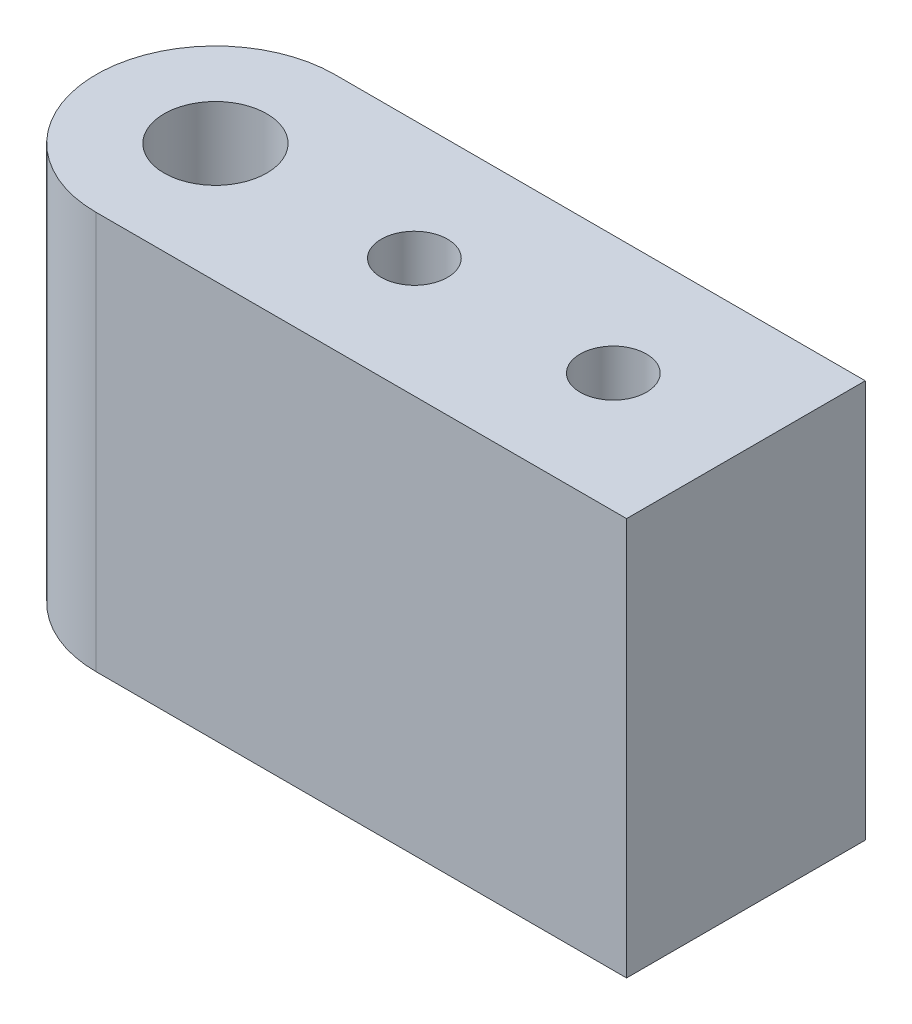
ISO-10303-21;
HEADER;
FILE_DESCRIPTION(('STEP AP214'),'2;1');
FILE_NAME('part.step','',(''),(''),'','','');
FILE_SCHEMA(('AUTOMOTIVE_DESIGN { 1 0 10303 214 1 1 1 1 }'));
ENDSEC;
DATA;
#1=APPLICATION_CONTEXT('core data for automotive mechanical design processes');
#2=APPLICATION_PROTOCOL_DEFINITION('international standard','automotive_design',2000,#1);
#3=PRODUCT_CONTEXT('',#1,'mechanical');
#4=PRODUCT('Part','Part','',(#3));
#5=PRODUCT_RELATED_PRODUCT_CATEGORY('part','',(#4));
#6=PRODUCT_DEFINITION_FORMATION('','',#4);
#7=PRODUCT_DEFINITION_CONTEXT('part definition',#1,'design');
#8=PRODUCT_DEFINITION('design','',#6,#7);
#9=PRODUCT_DEFINITION_SHAPE('','',#8);
#10=(LENGTH_UNIT() NAMED_UNIT(*) SI_UNIT(.MILLI.,.METRE.));
#11=(NAMED_UNIT(*) PLANE_ANGLE_UNIT() SI_UNIT($,.RADIAN.));
#12=(NAMED_UNIT(*) SI_UNIT($,.STERADIAN.) SOLID_ANGLE_UNIT());
#13=UNCERTAINTY_MEASURE_WITH_UNIT(LENGTH_MEASURE(1.E-05),#10,'distance_accuracy_value','');
#14=(GEOMETRIC_REPRESENTATION_CONTEXT(3) GLOBAL_UNCERTAINTY_ASSIGNED_CONTEXT((#13)) GLOBAL_UNIT_ASSIGNED_CONTEXT((#10,
#11,#12)) REPRESENTATION_CONTEXT('',''));
#15=CARTESIAN_POINT('',(0.,0.,0.));
#16=DIRECTION('',(0.,0.,1.));
#17=DIRECTION('',(1.,0.,0.));
#18=AXIS2_PLACEMENT_3D('',#15,#16,#17);
#19=CARTESIAN_POINT('',(0.,15.,-9.));
#20=DIRECTION('',(0.,0.,-1.));
#21=DIRECTION('',(-1.,0.,0.));
#22=AXIS2_PLACEMENT_3D('',#19,#20,#21);
#23=PLANE('',#22);
#24=DIRECTION('',(1.,0.,0.));
#25=VECTOR('',#24,1.);
#26=CARTESIAN_POINT('',(0.,0.,-9.));
#27=LINE('',#26,#25);
#28=CARTESIAN_POINT('',(0.,0.,-9.));
#29=VERTEX_POINT('',#28);
#30=CARTESIAN_POINT('',(20.,0.,-9.));
#31=VERTEX_POINT('',#30);
#32=EDGE_CURVE('E104',#29,#31,#27,.T.);
#33=ORIENTED_EDGE('',*,*,#32,.F.);
#34=DIRECTION('',(0.,-1.,0.));
#35=VECTOR('',#34,1.);
#36=CARTESIAN_POINT('',(0.,15.,-9.));
#37=LINE('',#36,#35);
#38=CARTESIAN_POINT('',(0.,15.,-9.));
#39=VERTEX_POINT('',#38);
#40=EDGE_CURVE('E11',#39,#29,#37,.T.);
#41=ORIENTED_EDGE('',*,*,#40,.F.);
#42=DIRECTION('',(1.,0.,0.));
#43=VECTOR('',#42,1.);
#44=CARTESIAN_POINT('',(0.,15.,-9.));
#45=LINE('',#44,#43);
#46=CARTESIAN_POINT('',(20.,15.,-9.));
#47=VERTEX_POINT('',#46);
#48=EDGE_CURVE('E90',#39,#47,#45,.T.);
#49=ORIENTED_EDGE('',*,*,#48,.T.);
#50=DIRECTION('',(0.,-1.,0.));
#51=VECTOR('',#50,1.);
#52=CARTESIAN_POINT('',(20.,15.,-9.));
#53=LINE('',#52,#51);
#54=EDGE_CURVE('E72',#47,#31,#53,.T.);
#55=ORIENTED_EDGE('',*,*,#54,.T.);
#56=EDGE_LOOP('',(#33,#41,#49,#55));
#57=FACE_BOUND('',#56,.T.);
#58=ADVANCED_FACE('F33',(#57),#23,.T.);
#59=CARTESIAN_POINT('',(0.,15.,-4.5));
#60=DIRECTION('',(0.,-1.,0.));
#61=DIRECTION('',(0.,0.,-1.));
#62=AXIS2_PLACEMENT_3D('',#59,#60,#61);
#63=CYLINDRICAL_SURFACE('',#62,4.5);
#64=CARTESIAN_POINT('',(0.,0.,-4.5));
#65=DIRECTION('',(0.,1.,0.));
#66=DIRECTION('',(0.,0.,1.));
#67=AXIS2_PLACEMENT_3D('',#64,#65,#66);
#68=CIRCLE('',#67,4.5);
#69=CARTESIAN_POINT('',(0.,0.,0.));
#70=VERTEX_POINT('',#69);
#71=EDGE_CURVE('E95',#29,#70,#68,.T.);
#72=ORIENTED_EDGE('',*,*,#71,.T.);
#73=DIRECTION('',(0.,-1.,0.));
#74=VECTOR('',#73,1.);
#75=CARTESIAN_POINT('',(0.,15.,0.));
#76=LINE('',#75,#74);
#77=CARTESIAN_POINT('',(0.,15.,0.));
#78=VERTEX_POINT('',#77);
#79=EDGE_CURVE('E42',#78,#70,#76,.T.);
#80=ORIENTED_EDGE('',*,*,#79,.F.);
#81=CARTESIAN_POINT('',(0.,15.,-4.5));
#82=DIRECTION('',(0.,1.,0.));
#83=DIRECTION('',(0.,0.,1.));
#84=AXIS2_PLACEMENT_3D('',#81,#82,#83);
#85=CIRCLE('',#84,4.5);
#86=EDGE_CURVE('E87',#39,#78,#85,.T.);
#87=ORIENTED_EDGE('',*,*,#86,.F.);
#88=ORIENTED_EDGE('',*,*,#40,.T.);
#89=EDGE_LOOP('',(#72,#80,#87,#88));
#90=FACE_BOUND('',#89,.T.);
#91=ADVANCED_FACE('F93',(#90),#63,.T.);
#92=CARTESIAN_POINT('',(0.,15.,0.));
#93=DIRECTION('',(0.,0.,-1.));
#94=DIRECTION('',(-1.,0.,0.));
#95=AXIS2_PLACEMENT_3D('',#92,#93,#94);
#96=PLANE('',#95);
#97=DIRECTION('',(1.,0.,0.));
#98=VECTOR('',#97,1.);
#99=CARTESIAN_POINT('',(0.,0.,0.));
#100=LINE('',#99,#98);
#101=CARTESIAN_POINT('',(20.,0.,0.));
#102=VERTEX_POINT('',#101);
#103=EDGE_CURVE('E101',#70,#102,#100,.T.);
#104=ORIENTED_EDGE('',*,*,#103,.T.);
#105=DIRECTION('',(0.,-1.,0.));
#106=VECTOR('',#105,1.);
#107=CARTESIAN_POINT('',(20.,15.,0.));
#108=LINE('',#107,#106);
#109=CARTESIAN_POINT('',(20.,15.,0.));
#110=VERTEX_POINT('',#109);
#111=EDGE_CURVE('E86',#110,#102,#108,.T.);
#112=ORIENTED_EDGE('',*,*,#111,.F.);
#113=DIRECTION('',(1.,0.,0.));
#114=VECTOR('',#113,1.);
#115=CARTESIAN_POINT('',(0.,15.,0.));
#116=LINE('',#115,#114);
#117=EDGE_CURVE('E80',#78,#110,#116,.T.);
#118=ORIENTED_EDGE('',*,*,#117,.F.);
#119=ORIENTED_EDGE('',*,*,#79,.T.);
#120=EDGE_LOOP('',(#104,#112,#118,#119));
#121=FACE_BOUND('',#120,.T.);
#122=ADVANCED_FACE('F83',(#121),#96,.F.);
#123=CARTESIAN_POINT('',(7.5,15.,-4.5));
#124=DIRECTION('',(0.,-1.,0.));
#125=DIRECTION('',(0.,0.,-1.));
#126=AXIS2_PLACEMENT_3D('',#123,#124,#125);
#127=CYLINDRICAL_SURFACE('',#126,1.25);
#128=CARTESIAN_POINT('',(7.5,15.,-4.5));
#129=DIRECTION('',(0.,1.,0.));
#130=DIRECTION('',(0.,0.,1.));
#131=AXIS2_PLACEMENT_3D('',#128,#129,#130);
#132=CIRCLE('',#131,1.25);
#133=CARTESIAN_POINT('',(7.5,15.,-3.25));
#134=VERTEX_POINT('',#133);
#135=EDGE_CURVE('E117',#134,#134,#132,.T.);
#136=ORIENTED_EDGE('',*,*,#135,.T.);
#137=EDGE_LOOP('',(#136));
#138=FACE_BOUND('',#137,.T.);
#139=CARTESIAN_POINT('',(7.5,0.,-4.5));
#140=DIRECTION('',(0.,1.,0.));
#141=DIRECTION('',(0.,0.,1.));
#142=AXIS2_PLACEMENT_3D('',#139,#140,#141);
#143=CIRCLE('',#142,1.25);
#144=CARTESIAN_POINT('',(7.5,0.,-3.25));
#145=VERTEX_POINT('',#144);
#146=EDGE_CURVE('E106',#145,#145,#143,.T.);
#147=ORIENTED_EDGE('',*,*,#146,.F.);
#148=EDGE_LOOP('',(#147));
#149=FACE_BOUND('',#148,.T.);
#150=ADVANCED_FACE('F137',(#138,#149),#127,.F.);
#151=CARTESIAN_POINT('',(15.,15.,-4.5));
#152=DIRECTION('',(0.,-1.,0.));
#153=DIRECTION('',(0.,0.,-1.));
#154=AXIS2_PLACEMENT_3D('',#151,#152,#153);
#155=CYLINDRICAL_SURFACE('',#154,1.25);
#156=CARTESIAN_POINT('',(15.,15.,-4.5));
#157=DIRECTION('',(0.,1.,0.));
#158=DIRECTION('',(0.,0.,1.));
#159=AXIS2_PLACEMENT_3D('',#156,#157,#158);
#160=CIRCLE('',#159,1.25);
#161=CARTESIAN_POINT('',(15.,15.,-3.25));
#162=VERTEX_POINT('',#161);
#163=EDGE_CURVE('E120',#162,#162,#160,.T.);
#164=ORIENTED_EDGE('',*,*,#163,.T.);
#165=EDGE_LOOP('',(#164));
#166=FACE_BOUND('',#165,.T.);
#167=CARTESIAN_POINT('',(15.,0.,-4.5));
#168=DIRECTION('',(0.,1.,0.));
#169=DIRECTION('',(0.,0.,1.));
#170=AXIS2_PLACEMENT_3D('',#167,#168,#169);
#171=CIRCLE('',#170,1.25);
#172=CARTESIAN_POINT('',(15.,0.,-3.25));
#173=VERTEX_POINT('',#172);
#174=EDGE_CURVE('E109',#173,#173,#171,.T.);
#175=ORIENTED_EDGE('',*,*,#174,.F.);
#176=EDGE_LOOP('',(#175));
#177=FACE_BOUND('',#176,.T.);
#178=ADVANCED_FACE('F140',(#166,#177),#155,.F.);
#179=CARTESIAN_POINT('',(0.,15.,-4.5));
#180=DIRECTION('',(0.,-1.,0.));
#181=DIRECTION('',(0.,0.,-1.));
#182=AXIS2_PLACEMENT_3D('',#179,#180,#181);
#183=CYLINDRICAL_SURFACE('',#182,1.93723602496411);
#184=CARTESIAN_POINT('',(0.,15.,-4.5));
#185=DIRECTION('',(0.,1.,0.));
#186=DIRECTION('',(0.,0.,1.));
#187=AXIS2_PLACEMENT_3D('',#184,#185,#186);
#188=CIRCLE('',#187,1.93723602496411);
#189=CARTESIAN_POINT('',(0.,15.,-2.56276397503589));
#190=VERTEX_POINT('',#189);
#191=EDGE_CURVE('E100',#190,#190,#188,.T.);
#192=ORIENTED_EDGE('',*,*,#191,.T.);
#193=EDGE_LOOP('',(#192));
#194=FACE_BOUND('',#193,.T.);
#195=CARTESIAN_POINT('',(0.,0.,-4.5));
#196=DIRECTION('',(0.,1.,0.));
#197=DIRECTION('',(0.,0.,1.));
#198=AXIS2_PLACEMENT_3D('',#195,#196,#197);
#199=CIRCLE('',#198,1.93723602496411);
#200=CARTESIAN_POINT('',(0.,0.,-2.56276397503589));
#201=VERTEX_POINT('',#200);
#202=EDGE_CURVE('E112',#201,#201,#199,.T.);
#203=ORIENTED_EDGE('',*,*,#202,.F.);
#204=EDGE_LOOP('',(#203));
#205=FACE_BOUND('',#204,.T.);
#206=ADVANCED_FACE('F35',(#194,#205),#183,.F.);
#207=CARTESIAN_POINT('',(20.,15.,0.));
#208=DIRECTION('',(-1.,0.,0.));
#209=DIRECTION('',(0.,0.,1.));
#210=AXIS2_PLACEMENT_3D('',#207,#208,#209);
#211=PLANE('',#210);
#212=DIRECTION('',(0.,0.,-1.));
#213=VECTOR('',#212,1.);
#214=CARTESIAN_POINT('',(20.,0.,0.));
#215=LINE('',#214,#213);
#216=EDGE_CURVE('E65',#102,#31,#215,.T.);
#217=ORIENTED_EDGE('',*,*,#216,.T.);
#218=ORIENTED_EDGE('',*,*,#54,.F.);
#219=DIRECTION('',(0.,0.,-1.));
#220=VECTOR('',#219,1.);
#221=CARTESIAN_POINT('',(20.,15.,0.));
#222=LINE('',#221,#220);
#223=EDGE_CURVE('E50',#110,#47,#222,.T.);
#224=ORIENTED_EDGE('',*,*,#223,.F.);
#225=ORIENTED_EDGE('',*,*,#111,.T.);
#226=EDGE_LOOP('',(#217,#218,#224,#225));
#227=FACE_BOUND('',#226,.T.);
#228=ADVANCED_FACE('F131',(#227),#211,.F.);
#229=CARTESIAN_POINT('',(0.,15.,0.));
#230=DIRECTION('',(0.,1.,0.));
#231=DIRECTION('',(0.,0.,1.));
#232=AXIS2_PLACEMENT_3D('',#229,#230,#231);
#233=PLANE('',#232);
#234=ORIENTED_EDGE('',*,*,#191,.F.);
#235=EDGE_LOOP('',(#234));
#236=FACE_BOUND('',#235,.T.);
#237=ORIENTED_EDGE('',*,*,#163,.F.);
#238=EDGE_LOOP('',(#237));
#239=FACE_BOUND('',#238,.T.);
#240=ORIENTED_EDGE('',*,*,#135,.F.);
#241=EDGE_LOOP('',(#240));
#242=FACE_BOUND('',#241,.T.);
#243=ORIENTED_EDGE('',*,*,#48,.F.);
#244=ORIENTED_EDGE('',*,*,#86,.T.);
#245=ORIENTED_EDGE('',*,*,#117,.T.);
#246=ORIENTED_EDGE('',*,*,#223,.T.);
#247=EDGE_LOOP('',(#243,#244,#245,#246));
#248=FACE_BOUND('',#247,.T.);
#249=ADVANCED_FACE('F89',(#236,#239,#242,#248),#233,.T.);
#250=CARTESIAN_POINT('',(0.,0.,0.));
#251=DIRECTION('',(0.,1.,0.));
#252=DIRECTION('',(0.,0.,1.));
#253=AXIS2_PLACEMENT_3D('',#250,#251,#252);
#254=PLANE('',#253);
#255=ORIENTED_EDGE('',*,*,#202,.T.);
#256=EDGE_LOOP('',(#255));
#257=FACE_BOUND('',#256,.T.);
#258=ORIENTED_EDGE('',*,*,#174,.T.);
#259=EDGE_LOOP('',(#258));
#260=FACE_BOUND('',#259,.T.);
#261=ORIENTED_EDGE('',*,*,#146,.T.);
#262=EDGE_LOOP('',(#261));
#263=FACE_BOUND('',#262,.T.);
#264=ORIENTED_EDGE('',*,*,#32,.T.);
#265=ORIENTED_EDGE('',*,*,#216,.F.);
#266=ORIENTED_EDGE('',*,*,#103,.F.);
#267=ORIENTED_EDGE('',*,*,#71,.F.);
#268=EDGE_LOOP('',(#264,#265,#266,#267));
#269=FACE_BOUND('',#268,.T.);
#270=ADVANCED_FACE('F130',(#257,#260,#263,#269),#254,.F.);
#271=CLOSED_SHELL('',(#58,#91,#122,#150,#178,#206,#228,#249,#270));
#272=MANIFOLD_SOLID_BREP('B2',#271);
#273=ADVANCED_BREP_SHAPE_REPRESENTATION('',(#18,#272),#14);
#274=SHAPE_DEFINITION_REPRESENTATION(#9,#273);
ENDSEC;
END-ISO-10303-21;
